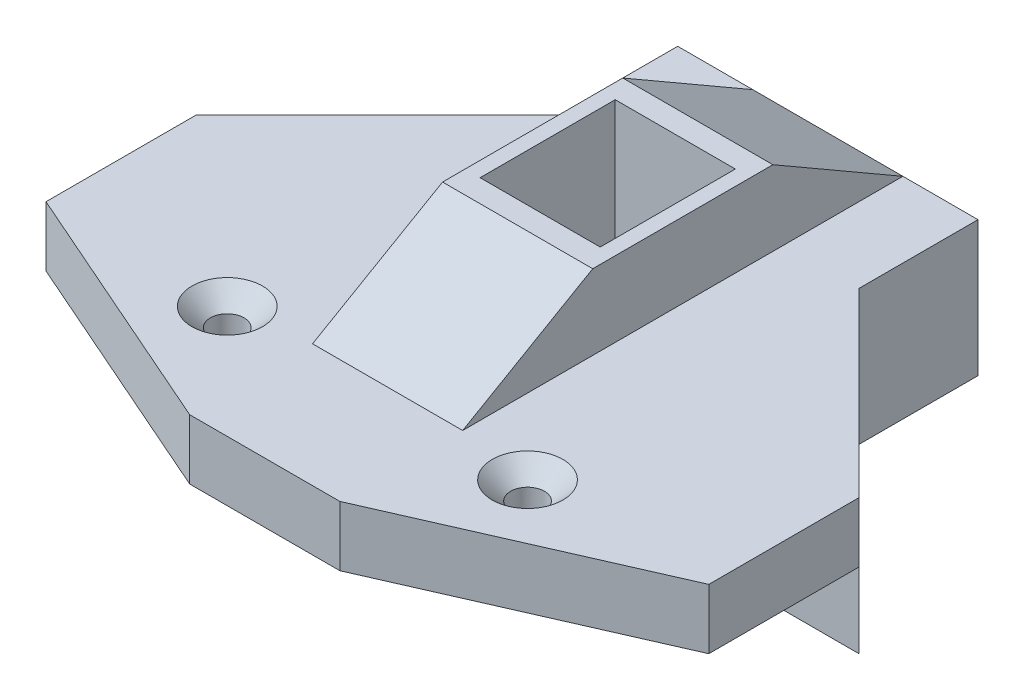
ISO-10303-21;
HEADER;
FILE_DESCRIPTION(('STEP AP214'),'2;1');
FILE_NAME('part.step','',(''),(''),'','','');
FILE_SCHEMA(('AUTOMOTIVE_DESIGN { 1 0 10303 214 1 1 1 1 }'));
ENDSEC;
DATA;
#1=APPLICATION_CONTEXT('core data for automotive mechanical design processes');
#2=APPLICATION_PROTOCOL_DEFINITION('international standard','automotive_design',2000,#1);
#3=PRODUCT_CONTEXT('',#1,'mechanical');
#4=PRODUCT('Part','Part','',(#3));
#5=PRODUCT_RELATED_PRODUCT_CATEGORY('part','',(#4));
#6=PRODUCT_DEFINITION_FORMATION('','',#4);
#7=PRODUCT_DEFINITION_CONTEXT('part definition',#1,'design');
#8=PRODUCT_DEFINITION('design','',#6,#7);
#9=PRODUCT_DEFINITION_SHAPE('','',#8);
#10=(LENGTH_UNIT() NAMED_UNIT(*) SI_UNIT(.MILLI.,.METRE.));
#11=(NAMED_UNIT(*) PLANE_ANGLE_UNIT() SI_UNIT($,.RADIAN.));
#12=(NAMED_UNIT(*) SI_UNIT($,.STERADIAN.) SOLID_ANGLE_UNIT());
#13=UNCERTAINTY_MEASURE_WITH_UNIT(LENGTH_MEASURE(1.E-05),#10,'distance_accuracy_value','');
#14=(GEOMETRIC_REPRESENTATION_CONTEXT(3) GLOBAL_UNCERTAINTY_ASSIGNED_CONTEXT((#13)) GLOBAL_UNIT_ASSIGNED_CONTEXT((#10,
#11,#12)) REPRESENTATION_CONTEXT('',''));
#15=CARTESIAN_POINT('',(0.,0.,0.));
#16=DIRECTION('',(0.,0.,1.));
#17=DIRECTION('',(1.,0.,0.));
#18=AXIS2_PLACEMENT_3D('',#15,#16,#17);
#19=CARTESIAN_POINT('',(0.,10.,0.));
#20=DIRECTION('',(0.,-1.,0.));
#21=DIRECTION('',(0.,0.,-1.));
#22=AXIS2_PLACEMENT_3D('',#19,#20,#21);
#23=PLANE('',#22);
#24=DIRECTION('',(0.,0.,1.));
#25=VECTOR('',#24,1.);
#26=CARTESIAN_POINT('',(8.00000000000001,10.,0.));
#27=LINE('',#26,#25);
#28=CARTESIAN_POINT('',(8.,10.,-39.679491924311));
#29=VERTEX_POINT('',#28);
#30=CARTESIAN_POINT('',(8.,10.,-21.679491924311));
#31=VERTEX_POINT('',#30);
#32=EDGE_CURVE('E256',#29,#31,#27,.T.);
#33=ORIENTED_EDGE('',*,*,#32,.F.);
#34=DIRECTION('',(1.,0.,0.));
#35=VECTOR('',#34,1.);
#36=CARTESIAN_POINT('',(0.,10.,-39.679491924311));
#37=LINE('',#36,#35);
#38=CARTESIAN_POINT('',(-8.,10.,-39.679491924311));
#39=VERTEX_POINT('',#38);
#40=EDGE_CURVE('E244',#39,#29,#37,.T.);
#41=ORIENTED_EDGE('',*,*,#40,.F.);
#42=DIRECTION('',(0.,0.,-1.));
#43=VECTOR('',#42,1.);
#44=CARTESIAN_POINT('',(-8.,10.,0.));
#45=LINE('',#44,#43);
#46=CARTESIAN_POINT('',(-8.,10.,-21.679491924311));
#47=VERTEX_POINT('',#46);
#48=EDGE_CURVE('E219',#47,#39,#45,.T.);
#49=ORIENTED_EDGE('',*,*,#48,.F.);
#50=DIRECTION('',(-1.,0.,0.));
#51=VECTOR('',#50,1.);
#52=CARTESIAN_POINT('',(0.,10.,-21.679491924311));
#53=LINE('',#52,#51);
#54=EDGE_CURVE('E253',#31,#47,#53,.T.);
#55=ORIENTED_EDGE('',*,*,#54,.F.);
#56=EDGE_LOOP('',(#33,#41,#49,#55));
#57=FACE_BOUND('',#56,.T.);
#58=CARTESIAN_POINT('',(-20.,10.,0.));
#59=DIRECTION('',(0.,-1.,0.));
#60=DIRECTION('',(0.,0.,-1.));
#61=AXIS2_PLACEMENT_3D('',#58,#59,#60);
#62=CIRCLE('',#61,2.24999999999999);
#63=CARTESIAN_POINT('',(-20.,10.,-2.24999999999999));
#64=VERTEX_POINT('',#63);
#65=EDGE_CURVE('E47',#64,#64,#62,.T.);
#66=ORIENTED_EDGE('',*,*,#65,.F.);
#67=EDGE_LOOP('',(#66));
#68=FACE_BOUND('',#67,.T.);
#69=CARTESIAN_POINT('',(20.,10.,0.));
#70=DIRECTION('',(0.,-1.,0.));
#71=DIRECTION('',(0.,0.,-1.));
#72=AXIS2_PLACEMENT_3D('',#69,#70,#71);
#73=CIRCLE('',#72,2.24999999999999);
#74=CARTESIAN_POINT('',(20.,10.,-2.24999999999999));
#75=VERTEX_POINT('',#74);
#76=EDGE_CURVE('E315',#75,#75,#73,.T.);
#77=ORIENTED_EDGE('',*,*,#76,.F.);
#78=EDGE_LOOP('',(#77));
#79=FACE_BOUND('',#78,.T.);
#80=DIRECTION('',(-1.,0.,0.));
#81=VECTOR('',#80,1.);
#82=CARTESIAN_POINT('',(-10.,10.,-60.));
#83=LINE('',#82,#81);
#84=CARTESIAN_POINT('',(10.,10.,-60.));
#85=VERTEX_POINT('',#84);
#86=CARTESIAN_POINT('',(-10.,10.,-60.));
#87=VERTEX_POINT('',#86);
#88=EDGE_CURVE('E415',#85,#87,#83,.T.);
#89=ORIENTED_EDGE('',*,*,#88,.F.);
#90=DIRECTION('',(0.,0.,1.));
#91=VECTOR('',#90,1.);
#92=CARTESIAN_POINT('',(10.,10.,-40.0000000000001));
#93=LINE('',#92,#91);
#94=CARTESIAN_POINT('',(10.,10.,-40.0000000000001));
#95=VERTEX_POINT('',#94);
#96=EDGE_CURVE('E337',#85,#95,#93,.T.);
#97=ORIENTED_EDGE('',*,*,#96,.T.);
#98=DIRECTION('',(0.707106781186546,0.,0.707106781186549));
#99=VECTOR('',#98,1.);
#100=CARTESIAN_POINT('',(30.,10.,-20.));
#101=LINE('',#100,#99);
#102=CARTESIAN_POINT('',(30.,10.,-20.));
#103=VERTEX_POINT('',#102);
#104=EDGE_CURVE('E359',#95,#103,#101,.T.);
#105=ORIENTED_EDGE('',*,*,#104,.T.);
#106=DIRECTION('',(1.,0.,0.));
#107=VECTOR('',#106,1.);
#108=CARTESIAN_POINT('',(30.,10.,-20.));
#109=LINE('',#108,#107);
#110=CARTESIAN_POINT('',(44.1421356237308,10.,-19.9999999999996));
#111=VERTEX_POINT('',#110);
#112=EDGE_CURVE('E332',#103,#111,#109,.T.);
#113=ORIENTED_EDGE('',*,*,#112,.T.);
#114=DIRECTION('',(0.,0.,-1.));
#115=VECTOR('',#114,1.);
#116=CARTESIAN_POINT('',(44.1421356237309,10.,-4.47558656802016E-13));
#117=LINE('',#116,#115);
#118=CARTESIAN_POINT('',(44.1421356237309,10.,-4.47558656802016E-13));
#119=VERTEX_POINT('',#118);
#120=EDGE_CURVE('E411',#119,#111,#117,.T.);
#121=ORIENTED_EDGE('',*,*,#120,.F.);
#122=DIRECTION('',(0.915537698439928,0.,-0.402232175161709));
#123=VECTOR('',#122,1.);
#124=CARTESIAN_POINT('',(44.1421356237309,10.,-4.47558656802016E-13));
#125=LINE('',#124,#123);
#126=CARTESIAN_POINT('',(10.,10.,15.));
#127=VERTEX_POINT('',#126);
#128=EDGE_CURVE('E408',#127,#119,#125,.T.);
#129=ORIENTED_EDGE('',*,*,#128,.F.);
#130=DIRECTION('',(1.,0.,0.));
#131=VECTOR('',#130,1.);
#132=CARTESIAN_POINT('',(-10.,10.,15.));
#133=LINE('',#132,#131);
#134=CARTESIAN_POINT('',(-10.,10.,15.));
#135=VERTEX_POINT('',#134);
#136=EDGE_CURVE('E405',#135,#127,#133,.T.);
#137=ORIENTED_EDGE('',*,*,#136,.F.);
#138=DIRECTION('',(0.915537698439932,0.,0.402232175161698));
#139=VECTOR('',#138,1.);
#140=CARTESIAN_POINT('',(-44.1421356237309,10.,0.));
#141=LINE('',#140,#139);
#142=CARTESIAN_POINT('',(-44.1421356237309,10.,0.));
#143=VERTEX_POINT('',#142);
#144=EDGE_CURVE('E355',#143,#135,#141,.T.);
#145=ORIENTED_EDGE('',*,*,#144,.F.);
#146=DIRECTION('',(0.,0.,1.));
#147=VECTOR('',#146,1.);
#148=CARTESIAN_POINT('',(-44.1421356237309,10.,-20.));
#149=LINE('',#148,#147);
#150=CARTESIAN_POINT('',(-44.1421356237309,10.,-20.));
#151=VERTEX_POINT('',#150);
#152=EDGE_CURVE('E371',#151,#143,#149,.T.);
#153=ORIENTED_EDGE('',*,*,#152,.F.);
#154=DIRECTION('',(1.,0.,0.));
#155=VECTOR('',#154,1.);
#156=CARTESIAN_POINT('',(-30.,10.,-20.));
#157=LINE('',#156,#155);
#158=CARTESIAN_POINT('',(-30.,10.,-20.));
#159=VERTEX_POINT('',#158);
#160=EDGE_CURVE('E450',#151,#159,#157,.T.);
#161=ORIENTED_EDGE('',*,*,#160,.T.);
#162=DIRECTION('',(0.707106781186545,0.,-0.70710678118655));
#163=VECTOR('',#162,1.);
#164=CARTESIAN_POINT('',(-30.,10.,-20.));
#165=LINE('',#164,#163);
#166=CARTESIAN_POINT('',(-10.,10.,-40.0000000000001));
#167=VERTEX_POINT('',#166);
#168=EDGE_CURVE('E454',#159,#167,#165,.T.);
#169=ORIENTED_EDGE('',*,*,#168,.T.);
#170=DIRECTION('',(0.,0.,-1.));
#171=VECTOR('',#170,1.);
#172=CARTESIAN_POINT('',(-10.,10.,-40.0000000000001));
#173=LINE('',#172,#171);
#174=EDGE_CURVE('E459',#167,#87,#173,.T.);
#175=ORIENTED_EDGE('',*,*,#174,.T.);
#176=EDGE_LOOP('',(#89,#97,#105,#113,#121,#129,#137,#145,#153,#161,#169,#175));
#177=FACE_BOUND('',#176,.T.);
#178=ADVANCED_FACE('F43',(#57,#68,#79,#177),#23,.T.);
#179=CARTESIAN_POINT('',(-10.,10.,-60.));
#180=DIRECTION('',(0.,0.,1.));
#181=DIRECTION('',(1.,0.,0.));
#182=AXIS2_PLACEMENT_3D('',#179,#180,#181);
#183=PLANE('',#182);
#184=DIRECTION('',(-1.,0.,0.));
#185=VECTOR('',#184,1.);
#186=CARTESIAN_POINT('',(-10.,0.,-60.));
#187=LINE('',#186,#185);
#188=CARTESIAN_POINT('',(-10.,0.,-60.));
#189=VERTEX_POINT('',#188);
#190=CARTESIAN_POINT('',(-20.,0.,-60.));
#191=VERTEX_POINT('',#190);
#192=EDGE_CURVE('E449',#189,#191,#187,.T.);
#193=ORIENTED_EDGE('',*,*,#192,.T.);
#194=DIRECTION('',(0.,-1.,0.));
#195=VECTOR('',#194,1.);
#196=CARTESIAN_POINT('',(-20.,10.,-60.));
#197=LINE('',#196,#195);
#198=CARTESIAN_POINT('',(-20.,18.,-60.));
#199=VERTEX_POINT('',#198);
#200=EDGE_CURVE('E11',#199,#191,#197,.T.);
#201=ORIENTED_EDGE('',*,*,#200,.F.);
#202=DIRECTION('',(-1.,0.,0.));
#203=VECTOR('',#202,1.);
#204=CARTESIAN_POINT('',(20.,18.,-60.));
#205=LINE('',#204,#203);
#206=CARTESIAN_POINT('',(-10.,18.,-60.));
#207=VERTEX_POINT('',#206);
#208=EDGE_CURVE('E386',#207,#199,#205,.T.);
#209=ORIENTED_EDGE('',*,*,#208,.F.);
#210=DIRECTION('',(-1.,0.,0.));
#211=VECTOR('',#210,1.);
#212=CARTESIAN_POINT('',(10.,18.,-60.));
#213=LINE('',#212,#211);
#214=CARTESIAN_POINT('',(10.,18.,-60.));
#215=VERTEX_POINT('',#214);
#216=EDGE_CURVE('E296',#215,#207,#213,.T.);
#217=ORIENTED_EDGE('',*,*,#216,.F.);
#218=CARTESIAN_POINT('',(20.,18.,-60.));
#219=VERTEX_POINT('',#218);
#220=EDGE_CURVE('E387',#219,#215,#205,.T.);
#221=ORIENTED_EDGE('',*,*,#220,.F.);
#222=DIRECTION('',(0.,-1.,0.));
#223=VECTOR('',#222,1.);
#224=CARTESIAN_POINT('',(20.,18.,-60.));
#225=LINE('',#224,#223);
#226=CARTESIAN_POINT('',(20.,0.,-60.));
#227=VERTEX_POINT('',#226);
#228=EDGE_CURVE('E427',#219,#227,#225,.T.);
#229=ORIENTED_EDGE('',*,*,#228,.T.);
#230=DIRECTION('',(-1.,0.,0.));
#231=VECTOR('',#230,1.);
#232=CARTESIAN_POINT('',(10.,0.,-60.));
#233=LINE('',#232,#231);
#234=CARTESIAN_POINT('',(10.,0.,-60.));
#235=VERTEX_POINT('',#234);
#236=EDGE_CURVE('E333',#227,#235,#233,.T.);
#237=ORIENTED_EDGE('',*,*,#236,.T.);
#238=DIRECTION('',(0.,-1.,0.));
#239=VECTOR('',#238,1.);
#240=CARTESIAN_POINT('',(10.,10.,-60.));
#241=LINE('',#240,#239);
#242=EDGE_CURVE('E328',#85,#235,#241,.T.);
#243=ORIENTED_EDGE('',*,*,#242,.F.);
#244=ORIENTED_EDGE('',*,*,#88,.T.);
#245=DIRECTION('',(0.,-1.,0.));
#246=VECTOR('',#245,1.);
#247=CARTESIAN_POINT('',(-10.,10.,-60.));
#248=LINE('',#247,#246);
#249=EDGE_CURVE('E463',#87,#189,#248,.T.);
#250=ORIENTED_EDGE('',*,*,#249,.T.);
#251=EDGE_LOOP('',(#193,#201,#209,#217,#221,#229,#237,#243,#244,#250));
#252=FACE_BOUND('',#251,.T.);
#253=ADVANCED_FACE('F45',(#252),#183,.F.);
#254=CARTESIAN_POINT('',(-20.,10.,-60.));
#255=DIRECTION('',(1.,0.,0.));
#256=DIRECTION('',(0.,0.,-1.));
#257=AXIS2_PLACEMENT_3D('',#254,#255,#256);
#258=PLANE('',#257);
#259=DIRECTION('',(0.,0.,1.));
#260=VECTOR('',#259,1.);
#261=CARTESIAN_POINT('',(-20.,0.,-60.));
#262=LINE('',#261,#260);
#263=CARTESIAN_POINT('',(-20.,0.,-44.1421356237311));
#264=VERTEX_POINT('',#263);
#265=EDGE_CURVE('E467',#191,#264,#262,.T.);
#266=ORIENTED_EDGE('',*,*,#265,.T.);
#267=DIRECTION('',(0.,-1.,0.));
#268=VECTOR('',#267,1.);
#269=CARTESIAN_POINT('',(-20.,10.,-44.1421356237311));
#270=LINE('',#269,#268);
#271=CARTESIAN_POINT('',(-20.,18.,-44.1421356237311));
#272=VERTEX_POINT('',#271);
#273=EDGE_CURVE('E53',#272,#264,#270,.T.);
#274=ORIENTED_EDGE('',*,*,#273,.F.);
#275=DIRECTION('',(0.,0.,1.));
#276=VECTOR('',#275,1.);
#277=CARTESIAN_POINT('',(-20.,18.,-60.));
#278=LINE('',#277,#276);
#279=EDGE_CURVE('E391',#199,#272,#278,.T.);
#280=ORIENTED_EDGE('',*,*,#279,.F.);
#281=ORIENTED_EDGE('',*,*,#200,.T.);
#282=EDGE_LOOP('',(#266,#274,#280,#281));
#283=FACE_BOUND('',#282,.T.);
#284=ADVANCED_FACE('F528',(#283),#258,.F.);
#285=CARTESIAN_POINT('',(-20.,10.,-44.1421356237311));
#286=DIRECTION('',(0.707106781186549,0.,0.707106781186546));
#287=DIRECTION('',(0.707106781186546,0.,-0.707106781186549));
#288=AXIS2_PLACEMENT_3D('',#285,#286,#287);
#289=PLANE('',#288);
#290=DIRECTION('',(-0.707106781186546,0.,0.707106781186549));
#291=VECTOR('',#290,1.);
#292=CARTESIAN_POINT('',(-20.,0.,-44.1421356237311));
#293=LINE('',#292,#291);
#294=CARTESIAN_POINT('',(-44.1421356237309,0.,-20.));
#295=VERTEX_POINT('',#294);
#296=EDGE_CURVE('E470',#264,#295,#293,.T.);
#297=ORIENTED_EDGE('',*,*,#296,.T.);
#298=DIRECTION('',(0.,-1.,0.));
#299=VECTOR('',#298,1.);
#300=CARTESIAN_POINT('',(-44.1421356237309,10.,-20.));
#301=LINE('',#300,#299);
#302=EDGE_CURVE('E492',#151,#295,#301,.T.);
#303=ORIENTED_EDGE('',*,*,#302,.F.);
#304=DIRECTION('',(0.,-1.,0.));
#305=VECTOR('',#304,1.);
#306=CARTESIAN_POINT('',(-44.1421356237309,18.,-20.));
#307=LINE('',#306,#305);
#308=CARTESIAN_POINT('',(-44.1421356237309,18.,-20.));
#309=VERTEX_POINT('',#308);
#310=EDGE_CURVE('E423',#309,#151,#307,.T.);
#311=ORIENTED_EDGE('',*,*,#310,.F.);
#312=DIRECTION('',(-0.707106781186546,0.,0.707106781186549));
#313=VECTOR('',#312,1.);
#314=CARTESIAN_POINT('',(-20.,18.,-44.1421356237311));
#315=LINE('',#314,#313);
#316=EDGE_CURVE('E395',#272,#309,#315,.T.);
#317=ORIENTED_EDGE('',*,*,#316,.F.);
#318=ORIENTED_EDGE('',*,*,#273,.T.);
#319=EDGE_LOOP('',(#297,#303,#311,#317,#318));
#320=FACE_BOUND('',#319,.T.);
#321=ADVANCED_FACE('F535',(#320),#289,.F.);
#322=CARTESIAN_POINT('',(-30.,10.,-20.));
#323=DIRECTION('',(0.,0.,-1.));
#324=DIRECTION('',(-1.,0.,0.));
#325=AXIS2_PLACEMENT_3D('',#322,#323,#324);
#326=PLANE('',#325);
#327=DIRECTION('',(1.,0.,0.));
#328=VECTOR('',#327,1.);
#329=CARTESIAN_POINT('',(-30.,0.,-20.));
#330=LINE('',#329,#328);
#331=CARTESIAN_POINT('',(-30.,0.,-20.));
#332=VERTEX_POINT('',#331);
#333=EDGE_CURVE('E473',#295,#332,#330,.T.);
#334=ORIENTED_EDGE('',*,*,#333,.T.);
#335=DIRECTION('',(0.,-1.,0.));
#336=VECTOR('',#335,1.);
#337=CARTESIAN_POINT('',(-30.,10.,-20.));
#338=LINE('',#337,#336);
#339=EDGE_CURVE('E488',#159,#332,#338,.T.);
#340=ORIENTED_EDGE('',*,*,#339,.F.);
#341=ORIENTED_EDGE('',*,*,#160,.F.);
#342=ORIENTED_EDGE('',*,*,#302,.T.);
#343=EDGE_LOOP('',(#334,#340,#341,#342));
#344=FACE_BOUND('',#343,.T.);
#345=ADVANCED_FACE('F659',(#344),#326,.F.);
#346=CARTESIAN_POINT('',(-30.,10.,-20.));
#347=DIRECTION('',(-0.70710678118655,0.,-0.707106781186545));
#348=DIRECTION('',(-0.707106781186545,0.,0.70710678118655));
#349=AXIS2_PLACEMENT_3D('',#346,#347,#348);
#350=PLANE('',#349);
#351=DIRECTION('',(0.707106781186545,0.,-0.70710678118655));
#352=VECTOR('',#351,1.);
#353=CARTESIAN_POINT('',(-30.,0.,-20.));
#354=LINE('',#353,#352);
#355=CARTESIAN_POINT('',(-10.,0.,-40.0000000000001));
#356=VERTEX_POINT('',#355);
#357=EDGE_CURVE('E476',#332,#356,#354,.T.);
#358=ORIENTED_EDGE('',*,*,#357,.T.);
#359=DIRECTION('',(0.,-1.,0.));
#360=VECTOR('',#359,1.);
#361=CARTESIAN_POINT('',(-10.,10.,-40.0000000000001));
#362=LINE('',#361,#360);
#363=EDGE_CURVE('E484',#167,#356,#362,.T.);
#364=ORIENTED_EDGE('',*,*,#363,.F.);
#365=ORIENTED_EDGE('',*,*,#168,.F.);
#366=ORIENTED_EDGE('',*,*,#339,.T.);
#367=EDGE_LOOP('',(#358,#364,#365,#366));
#368=FACE_BOUND('',#367,.T.);
#369=ADVANCED_FACE('F656',(#368),#350,.F.);
#370=CARTESIAN_POINT('',(-10.,10.,-40.0000000000001));
#371=DIRECTION('',(-1.,0.,0.));
#372=DIRECTION('',(0.,0.,1.));
#373=AXIS2_PLACEMENT_3D('',#370,#371,#372);
#374=PLANE('',#373);
#375=DIRECTION('',(0.,0.,-1.));
#376=VECTOR('',#375,1.);
#377=CARTESIAN_POINT('',(-10.,0.,-40.0000000000001));
#378=LINE('',#377,#376);
#379=EDGE_CURVE('E455',#356,#189,#378,.T.);
#380=ORIENTED_EDGE('',*,*,#379,.T.);
#381=ORIENTED_EDGE('',*,*,#249,.F.);
#382=ORIENTED_EDGE('',*,*,#174,.F.);
#383=ORIENTED_EDGE('',*,*,#363,.T.);
#384=EDGE_LOOP('',(#380,#381,#382,#383));
#385=FACE_BOUND('',#384,.T.);
#386=ADVANCED_FACE('F516',(#385),#374,.F.);
#387=CARTESIAN_POINT('',(0.,0.,0.));
#388=DIRECTION('',(0.,1.,0.));
#389=DIRECTION('',(0.,0.,1.));
#390=AXIS2_PLACEMENT_3D('',#387,#388,#389);
#391=PLANE('',#390);
#392=ORIENTED_EDGE('',*,*,#192,.F.);
#393=ORIENTED_EDGE('',*,*,#379,.F.);
#394=ORIENTED_EDGE('',*,*,#357,.F.);
#395=ORIENTED_EDGE('',*,*,#333,.F.);
#396=ORIENTED_EDGE('',*,*,#296,.F.);
#397=ORIENTED_EDGE('',*,*,#265,.F.);
#398=EDGE_LOOP('',(#392,#393,#394,#395,#396,#397));
#399=FACE_BOUND('',#398,.T.);
#400=ADVANCED_FACE('F520',(#399),#391,.F.);
#401=CARTESIAN_POINT('',(-44.1421356237309,18.,0.));
#402=DIRECTION('',(0.402232175161698,0.,-0.915537698439932));
#403=DIRECTION('',(-0.915537698439933,0.,-0.402232175161699));
#404=AXIS2_PLACEMENT_3D('',#401,#402,#403);
#405=PLANE('',#404);
#406=ORIENTED_EDGE('',*,*,#144,.T.);
#407=DIRECTION('',(0.,-1.,0.));
#408=VECTOR('',#407,1.);
#409=CARTESIAN_POINT('',(-10.,18.,15.));
#410=LINE('',#409,#408);
#411=CARTESIAN_POINT('',(-10.,18.,15.));
#412=VERTEX_POINT('',#411);
#413=EDGE_CURVE('E445',#412,#135,#410,.T.);
#414=ORIENTED_EDGE('',*,*,#413,.F.);
#415=DIRECTION('',(0.915537698439932,0.,0.402232175161698));
#416=VECTOR('',#415,1.);
#417=CARTESIAN_POINT('',(-44.1421356237309,18.,0.));
#418=LINE('',#417,#416);
#419=CARTESIAN_POINT('',(-44.1421356237309,18.,0.));
#420=VERTEX_POINT('',#419);
#421=EDGE_CURVE('E366',#420,#412,#418,.T.);
#422=ORIENTED_EDGE('',*,*,#421,.F.);
#423=DIRECTION('',(0.,-1.,0.));
#424=VECTOR('',#423,1.);
#425=CARTESIAN_POINT('',(-44.1421356237309,18.,0.));
#426=LINE('',#425,#424);
#427=EDGE_CURVE('E401',#420,#143,#426,.T.);
#428=ORIENTED_EDGE('',*,*,#427,.T.);
#429=EDGE_LOOP('',(#406,#414,#422,#428));
#430=FACE_BOUND('',#429,.T.);
#431=ADVANCED_FACE('F546',(#430),#405,.F.);
#432=CARTESIAN_POINT('',(-10.,18.,15.));
#433=DIRECTION('',(0.,0.,-1.));
#434=DIRECTION('',(-1.,0.,0.));
#435=AXIS2_PLACEMENT_3D('',#432,#433,#434);
#436=PLANE('',#435);
#437=ORIENTED_EDGE('',*,*,#136,.T.);
#438=DIRECTION('',(0.,-1.,0.));
#439=VECTOR('',#438,1.);
#440=CARTESIAN_POINT('',(10.,18.,15.));
#441=LINE('',#440,#439);
#442=CARTESIAN_POINT('',(10.,18.,15.));
#443=VERTEX_POINT('',#442);
#444=EDGE_CURVE('E441',#443,#127,#441,.T.);
#445=ORIENTED_EDGE('',*,*,#444,.F.);
#446=DIRECTION('',(1.,0.,0.));
#447=VECTOR('',#446,1.);
#448=CARTESIAN_POINT('',(-10.,18.,15.));
#449=LINE('',#448,#447);
#450=EDGE_CURVE('E370',#412,#443,#449,.T.);
#451=ORIENTED_EDGE('',*,*,#450,.F.);
#452=ORIENTED_EDGE('',*,*,#413,.T.);
#453=EDGE_LOOP('',(#437,#445,#451,#452));
#454=FACE_BOUND('',#453,.T.);
#455=ADVANCED_FACE('F549',(#454),#436,.F.);
#456=CARTESIAN_POINT('',(44.1421356237309,18.,-4.47558656802016E-13));
#457=DIRECTION('',(-0.402232175161708,0.,-0.915537698439928));
#458=DIRECTION('',(-0.915537698439928,0.,0.402232175161709));
#459=AXIS2_PLACEMENT_3D('',#456,#457,#458);
#460=PLANE('',#459);
#461=ORIENTED_EDGE('',*,*,#128,.T.);
#462=DIRECTION('',(0.,-1.,0.));
#463=VECTOR('',#462,1.);
#464=CARTESIAN_POINT('',(44.1421356237309,18.,-4.47558656802016E-13));
#465=LINE('',#464,#463);
#466=CARTESIAN_POINT('',(44.1421356237309,18.,-4.47558656802016E-13));
#467=VERTEX_POINT('',#466);
#468=EDGE_CURVE('E437',#467,#119,#465,.T.);
#469=ORIENTED_EDGE('',*,*,#468,.F.);
#470=DIRECTION('',(0.915537698439928,0.,-0.402232175161709));
#471=VECTOR('',#470,1.);
#472=CARTESIAN_POINT('',(44.1421356237309,18.,-4.47558656802016E-13));
#473=LINE('',#472,#471);
#474=EDGE_CURVE('E374',#443,#467,#473,.T.);
#475=ORIENTED_EDGE('',*,*,#474,.F.);
#476=ORIENTED_EDGE('',*,*,#444,.T.);
#477=EDGE_LOOP('',(#461,#469,#475,#476));
#478=FACE_BOUND('',#477,.T.);
#479=ADVANCED_FACE('F554',(#478),#460,.F.);
#480=CARTESIAN_POINT('',(44.1421356237309,18.,-4.47558656802016E-13));
#481=DIRECTION('',(-1.,0.,0.));
#482=DIRECTION('',(0.,0.,1.));
#483=AXIS2_PLACEMENT_3D('',#480,#481,#482);
#484=PLANE('',#483);
#485=ORIENTED_EDGE('',*,*,#120,.T.);
#486=DIRECTION('',(0.,-1.,0.));
#487=VECTOR('',#486,1.);
#488=CARTESIAN_POINT('',(44.1421356237308,18.,-19.9999999999996));
#489=LINE('',#488,#487);
#490=CARTESIAN_POINT('',(44.1421356237308,18.,-19.9999999999996));
#491=VERTEX_POINT('',#490);
#492=EDGE_CURVE('E433',#491,#111,#489,.T.);
#493=ORIENTED_EDGE('',*,*,#492,.F.);
#494=DIRECTION('',(0.,0.,-1.));
#495=VECTOR('',#494,1.);
#496=CARTESIAN_POINT('',(44.1421356237309,18.,-4.47558656802016E-13));
#497=LINE('',#496,#495);
#498=EDGE_CURVE('E377',#467,#491,#497,.T.);
#499=ORIENTED_EDGE('',*,*,#498,.F.);
#500=ORIENTED_EDGE('',*,*,#468,.T.);
#501=EDGE_LOOP('',(#485,#493,#499,#500));
#502=FACE_BOUND('',#501,.T.);
#503=ADVANCED_FACE('F560',(#502),#484,.F.);
#504=CARTESIAN_POINT('',(44.1421356237308,18.,-19.9999999999996));
#505=DIRECTION('',(-0.707106781186557,0.,0.707106781186538));
#506=DIRECTION('',(0.707106781186538,0.,0.707106781186557));
#507=AXIS2_PLACEMENT_3D('',#504,#505,#506);
#508=PLANE('',#507);
#509=ORIENTED_EDGE('',*,*,#492,.T.);
#510=DIRECTION('',(0.,-1.,0.));
#511=VECTOR('',#510,1.);
#512=CARTESIAN_POINT('',(44.1421356237308,10.,-19.9999999999996));
#513=LINE('',#512,#511);
#514=CARTESIAN_POINT('',(44.1421356237308,0.,-19.9999999999996));
#515=VERTEX_POINT('',#514);
#516=EDGE_CURVE('E324',#111,#515,#513,.T.);
#517=ORIENTED_EDGE('',*,*,#516,.T.);
#518=DIRECTION('',(-0.707106781186538,0.,-0.707106781186557));
#519=VECTOR('',#518,1.);
#520=CARTESIAN_POINT('',(20.,0.,-44.142135623731));
#521=LINE('',#520,#519);
#522=CARTESIAN_POINT('',(20.,0.,-44.142135623731));
#523=VERTEX_POINT('',#522);
#524=EDGE_CURVE('E341',#515,#523,#521,.T.);
#525=ORIENTED_EDGE('',*,*,#524,.T.);
#526=DIRECTION('',(0.,-1.,0.));
#527=VECTOR('',#526,1.);
#528=CARTESIAN_POINT('',(20.,18.,-44.142135623731));
#529=LINE('',#528,#527);
#530=CARTESIAN_POINT('',(20.,18.,-44.142135623731));
#531=VERTEX_POINT('',#530);
#532=EDGE_CURVE('E430',#531,#523,#529,.T.);
#533=ORIENTED_EDGE('',*,*,#532,.F.);
#534=DIRECTION('',(-0.707106781186538,0.,-0.707106781186557));
#535=VECTOR('',#534,1.);
#536=CARTESIAN_POINT('',(44.1421356237308,18.,-19.9999999999996));
#537=LINE('',#536,#535);
#538=EDGE_CURVE('E380',#491,#531,#537,.T.);
#539=ORIENTED_EDGE('',*,*,#538,.F.);
#540=EDGE_LOOP('',(#509,#517,#525,#533,#539));
#541=FACE_BOUND('',#540,.T.);
#542=ADVANCED_FACE('F563',(#541),#508,.F.);
#543=CARTESIAN_POINT('',(20.,18.,-44.142135623731));
#544=DIRECTION('',(-1.,0.,0.));
#545=DIRECTION('',(0.,0.,1.));
#546=AXIS2_PLACEMENT_3D('',#543,#544,#545);
#547=PLANE('',#546);
#548=ORIENTED_EDGE('',*,*,#532,.T.);
#549=DIRECTION('',(0.,0.,-1.));
#550=VECTOR('',#549,1.);
#551=CARTESIAN_POINT('',(20.,0.,-60.));
#552=LINE('',#551,#550);
#553=EDGE_CURVE('E336',#523,#227,#552,.T.);
#554=ORIENTED_EDGE('',*,*,#553,.T.);
#555=ORIENTED_EDGE('',*,*,#228,.F.);
#556=DIRECTION('',(0.,0.,-1.));
#557=VECTOR('',#556,1.);
#558=CARTESIAN_POINT('',(20.,18.,-44.142135623731));
#559=LINE('',#558,#557);
#560=EDGE_CURVE('E383',#531,#219,#559,.T.);
#561=ORIENTED_EDGE('',*,*,#560,.F.);
#562=EDGE_LOOP('',(#548,#554,#555,#561));
#563=FACE_BOUND('',#562,.T.);
#564=ADVANCED_FACE('F569',(#563),#547,.F.);
#565=CARTESIAN_POINT('',(-44.1421356237309,18.,-20.));
#566=DIRECTION('',(1.,0.,0.));
#567=DIRECTION('',(0.,0.,-1.));
#568=AXIS2_PLACEMENT_3D('',#565,#566,#567);
#569=PLANE('',#568);
#570=ORIENTED_EDGE('',*,*,#152,.T.);
#571=ORIENTED_EDGE('',*,*,#427,.F.);
#572=DIRECTION('',(0.,0.,1.));
#573=VECTOR('',#572,1.);
#574=CARTESIAN_POINT('',(-44.1421356237309,18.,-20.));
#575=LINE('',#574,#573);
#576=EDGE_CURVE('E398',#309,#420,#575,.T.);
#577=ORIENTED_EDGE('',*,*,#576,.F.);
#578=ORIENTED_EDGE('',*,*,#310,.T.);
#579=EDGE_LOOP('',(#570,#571,#577,#578));
#580=FACE_BOUND('',#579,.T.);
#581=ADVANCED_FACE('F541',(#580),#569,.F.);
#582=CARTESIAN_POINT('',(0.,18.,0.));
#583=DIRECTION('',(0.,-1.,0.));
#584=DIRECTION('',(0.,0.,-1.));
#585=AXIS2_PLACEMENT_3D('',#582,#583,#584);
#586=PLANE('',#585);
#587=DIRECTION('',(-1.,0.,0.));
#588=VECTOR('',#587,1.);
#589=CARTESIAN_POINT('',(10.,18.,-1.35898384862197));
#590=LINE('',#589,#588);
#591=CARTESIAN_POINT('',(10.,18.,-1.35898384862197));
#592=VERTEX_POINT('',#591);
#593=CARTESIAN_POINT('',(-10.,18.,-1.35898384862197));
#594=VERTEX_POINT('',#593);
#595=EDGE_CURVE('E273',#592,#594,#590,.T.);
#596=ORIENTED_EDGE('',*,*,#595,.T.);
#597=DIRECTION('',(0.,0.,-1.));
#598=VECTOR('',#597,1.);
#599=CARTESIAN_POINT('',(-10.,18.,-44.142135623731));
#600=LINE('',#599,#598);
#601=EDGE_CURVE('E259',#594,#207,#600,.T.);
#602=ORIENTED_EDGE('',*,*,#601,.T.);
#603=ORIENTED_EDGE('',*,*,#208,.T.);
#604=ORIENTED_EDGE('',*,*,#279,.T.);
#605=ORIENTED_EDGE('',*,*,#316,.T.);
#606=ORIENTED_EDGE('',*,*,#576,.T.);
#607=ORIENTED_EDGE('',*,*,#421,.T.);
#608=ORIENTED_EDGE('',*,*,#450,.T.);
#609=ORIENTED_EDGE('',*,*,#474,.T.);
#610=ORIENTED_EDGE('',*,*,#498,.T.);
#611=ORIENTED_EDGE('',*,*,#538,.T.);
#612=ORIENTED_EDGE('',*,*,#560,.T.);
#613=ORIENTED_EDGE('',*,*,#220,.T.);
#614=DIRECTION('',(0.,0.,-1.));
#615=VECTOR('',#614,1.);
#616=CARTESIAN_POINT('',(10.,18.,-1.35898384862197));
#617=LINE('',#616,#615);
#618=EDGE_CURVE('E260',#592,#215,#617,.T.);
#619=ORIENTED_EDGE('',*,*,#618,.F.);
#620=EDGE_LOOP('',(#596,#602,#603,#604,#605,#606,#607,#608,#609,#610,#611,#612,#613,#619));
#621=FACE_BOUND('',#620,.T.);
#622=CARTESIAN_POINT('',(-20.,18.,0.));
#623=DIRECTION('',(0.,1.,0.));
#624=DIRECTION('',(0.,0.,1.));
#625=AXIS2_PLACEMENT_3D('',#622,#623,#624);
#626=CIRCLE('',#625,4.7);
#627=CARTESIAN_POINT('',(-20.,18.,4.7));
#628=VERTEX_POINT('',#627);
#629=EDGE_CURVE('E299',#628,#628,#626,.T.);
#630=ORIENTED_EDGE('',*,*,#629,.F.);
#631=EDGE_LOOP('',(#630));
#632=FACE_BOUND('',#631,.T.);
#633=CARTESIAN_POINT('',(20.,18.,0.));
#634=DIRECTION('',(0.,1.,0.));
#635=DIRECTION('',(0.,0.,1.));
#636=AXIS2_PLACEMENT_3D('',#633,#634,#635);
#637=CIRCLE('',#636,4.7);
#638=CARTESIAN_POINT('',(20.,18.,4.7));
#639=VERTEX_POINT('',#638);
#640=EDGE_CURVE('E307',#639,#639,#637,.T.);
#641=ORIENTED_EDGE('',*,*,#640,.F.);
#642=EDGE_LOOP('',(#641));
#643=FACE_BOUND('',#642,.T.);
#644=ADVANCED_FACE('F531',(#621,#632,#643),#586,.F.);
#645=CARTESIAN_POINT('',(10.,10.,-40.0000000000001));
#646=DIRECTION('',(1.,0.,0.));
#647=DIRECTION('',(0.,0.,-1.));
#648=AXIS2_PLACEMENT_3D('',#645,#646,#647);
#649=PLANE('',#648);
#650=DIRECTION('',(0.,0.,1.));
#651=VECTOR('',#650,1.);
#652=CARTESIAN_POINT('',(10.,0.,-40.0000000000001));
#653=LINE('',#652,#651);
#654=CARTESIAN_POINT('',(10.,0.,-40.0000000000001));
#655=VERTEX_POINT('',#654);
#656=EDGE_CURVE('E351',#235,#655,#653,.T.);
#657=ORIENTED_EDGE('',*,*,#656,.T.);
#658=DIRECTION('',(0.,-1.,0.));
#659=VECTOR('',#658,1.);
#660=CARTESIAN_POINT('',(10.,10.,-40.0000000000001));
#661=LINE('',#660,#659);
#662=EDGE_CURVE('E316',#95,#655,#661,.T.);
#663=ORIENTED_EDGE('',*,*,#662,.F.);
#664=ORIENTED_EDGE('',*,*,#96,.F.);
#665=ORIENTED_EDGE('',*,*,#242,.T.);
#666=EDGE_LOOP('',(#657,#663,#664,#665));
#667=FACE_BOUND('',#666,.T.);
#668=ADVANCED_FACE('F621',(#667),#649,.F.);
#669=CARTESIAN_POINT('',(30.,10.,-20.));
#670=DIRECTION('',(0.707106781186549,0.,-0.707106781186546));
#671=DIRECTION('',(-0.707106781186546,0.,-0.707106781186549));
#672=AXIS2_PLACEMENT_3D('',#669,#670,#671);
#673=PLANE('',#672);
#674=DIRECTION('',(0.707106781186546,0.,0.707106781186549));
#675=VECTOR('',#674,1.);
#676=CARTESIAN_POINT('',(30.,0.,-20.));
#677=LINE('',#676,#675);
#678=CARTESIAN_POINT('',(30.,0.,-20.));
#679=VERTEX_POINT('',#678);
#680=EDGE_CURVE('E348',#655,#679,#677,.T.);
#681=ORIENTED_EDGE('',*,*,#680,.T.);
#682=DIRECTION('',(0.,-1.,0.));
#683=VECTOR('',#682,1.);
#684=CARTESIAN_POINT('',(30.,10.,-20.));
#685=LINE('',#684,#683);
#686=EDGE_CURVE('E320',#103,#679,#685,.T.);
#687=ORIENTED_EDGE('',*,*,#686,.F.);
#688=ORIENTED_EDGE('',*,*,#104,.F.);
#689=ORIENTED_EDGE('',*,*,#662,.T.);
#690=EDGE_LOOP('',(#681,#687,#688,#689));
#691=FACE_BOUND('',#690,.T.);
#692=ADVANCED_FACE('F624',(#691),#673,.F.);
#693=CARTESIAN_POINT('',(30.,10.,-20.));
#694=DIRECTION('',(0.,0.,-1.));
#695=DIRECTION('',(-1.,0.,0.));
#696=AXIS2_PLACEMENT_3D('',#693,#694,#695);
#697=PLANE('',#696);
#698=DIRECTION('',(1.,0.,0.));
#699=VECTOR('',#698,1.);
#700=CARTESIAN_POINT('',(30.,0.,-20.));
#701=LINE('',#700,#699);
#702=EDGE_CURVE('E345',#679,#515,#701,.T.);
#703=ORIENTED_EDGE('',*,*,#702,.T.);
#704=ORIENTED_EDGE('',*,*,#516,.F.);
#705=ORIENTED_EDGE('',*,*,#112,.F.);
#706=ORIENTED_EDGE('',*,*,#686,.T.);
#707=EDGE_LOOP('',(#703,#704,#705,#706));
#708=FACE_BOUND('',#707,.T.);
#709=ADVANCED_FACE('F628',(#708),#697,.F.);
#710=CARTESIAN_POINT('',(0.,0.,0.));
#711=DIRECTION('',(0.,-1.,0.));
#712=DIRECTION('',(0.,0.,-1.));
#713=AXIS2_PLACEMENT_3D('',#710,#711,#712);
#714=PLANE('',#713);
#715=ORIENTED_EDGE('',*,*,#656,.F.);
#716=ORIENTED_EDGE('',*,*,#236,.F.);
#717=ORIENTED_EDGE('',*,*,#553,.F.);
#718=ORIENTED_EDGE('',*,*,#524,.F.);
#719=ORIENTED_EDGE('',*,*,#702,.F.);
#720=ORIENTED_EDGE('',*,*,#680,.F.);
#721=EDGE_LOOP('',(#715,#716,#717,#718,#719,#720));
#722=FACE_BOUND('',#721,.T.);
#723=ADVANCED_FACE('F620',(#722),#714,.T.);
#724=CARTESIAN_POINT('',(20.,18.,0.));
#725=DIRECTION('',(0.,1.,0.));
#726=DIRECTION('',(0.,0.,1.));
#727=AXIS2_PLACEMENT_3D('',#724,#725,#726);
#728=CYLINDRICAL_SURFACE('',#727,2.24999999999999);
#729=ORIENTED_EDGE('',*,*,#76,.T.);
#730=EDGE_LOOP('',(#729));
#731=FACE_BOUND('',#730,.T.);
#732=CARTESIAN_POINT('',(20.,15.55,0.));
#733=DIRECTION('',(0.,1.,0.));
#734=DIRECTION('',(0.,0.,1.));
#735=AXIS2_PLACEMENT_3D('',#732,#733,#734);
#736=CIRCLE('',#735,2.24999999999999);
#737=CARTESIAN_POINT('',(20.,15.55,2.24999999999999));
#738=VERTEX_POINT('',#737);
#739=EDGE_CURVE('E311',#738,#738,#736,.T.);
#740=ORIENTED_EDGE('',*,*,#739,.T.);
#741=EDGE_LOOP('',(#740));
#742=FACE_BOUND('',#741,.T.);
#743=ADVANCED_FACE('F502',(#731,#742),#728,.F.);
#744=CARTESIAN_POINT('',(20.,18.,0.));
#745=DIRECTION('',(0.,1.,0.));
#746=DIRECTION('',(0.,0.,1.));
#747=AXIS2_PLACEMENT_3D('',#744,#745,#746);
#748=CONICAL_SURFACE('',#747,4.7,0.785398163397448);
#749=ORIENTED_EDGE('',*,*,#739,.F.);
#750=EDGE_LOOP('',(#749));
#751=FACE_BOUND('',#750,.T.);
#752=ORIENTED_EDGE('',*,*,#640,.T.);
#753=EDGE_LOOP('',(#752));
#754=FACE_BOUND('',#753,.T.);
#755=ADVANCED_FACE('F613',(#751,#754),#748,.F.);
#756=CARTESIAN_POINT('',(-20.,18.,0.));
#757=DIRECTION('',(0.,1.,0.));
#758=DIRECTION('',(0.,0.,1.));
#759=AXIS2_PLACEMENT_3D('',#756,#757,#758);
#760=CYLINDRICAL_SURFACE('',#759,2.24999999999999);
#761=ORIENTED_EDGE('',*,*,#65,.T.);
#762=EDGE_LOOP('',(#761));
#763=FACE_BOUND('',#762,.T.);
#764=CARTESIAN_POINT('',(-20.,15.55,0.));
#765=DIRECTION('',(0.,1.,0.));
#766=DIRECTION('',(0.,0.,1.));
#767=AXIS2_PLACEMENT_3D('',#764,#765,#766);
#768=CIRCLE('',#767,2.24999999999999);
#769=CARTESIAN_POINT('',(-20.,15.55,2.24999999999999));
#770=VERTEX_POINT('',#769);
#771=EDGE_CURVE('E303',#770,#770,#768,.T.);
#772=ORIENTED_EDGE('',*,*,#771,.T.);
#773=EDGE_LOOP('',(#772));
#774=FACE_BOUND('',#773,.T.);
#775=ADVANCED_FACE('F609',(#763,#774),#760,.F.);
#776=CARTESIAN_POINT('',(-20.,18.,0.));
#777=DIRECTION('',(0.,1.,0.));
#778=DIRECTION('',(0.,0.,1.));
#779=AXIS2_PLACEMENT_3D('',#776,#777,#778);
#780=CONICAL_SURFACE('',#779,4.7,0.785398163397448);
#781=ORIENTED_EDGE('',*,*,#771,.F.);
#782=EDGE_LOOP('',(#781));
#783=FACE_BOUND('',#782,.T.);
#784=ORIENTED_EDGE('',*,*,#629,.T.);
#785=EDGE_LOOP('',(#784));
#786=FACE_BOUND('',#785,.T.);
#787=ADVANCED_FACE('F606',(#783,#786),#780,.F.);
#788=CARTESIAN_POINT('',(10.,18.,-60.));
#789=DIRECTION('',(0.,-0.866025403784442,0.499999999999995));
#790=DIRECTION('',(0.,-0.499999999999995,-0.866025403784442));
#791=AXIS2_PLACEMENT_3D('',#788,#789,#790);
#792=PLANE('',#791);
#793=DIRECTION('',(0.,0.499999999999995,0.866025403784442));
#794=VECTOR('',#793,1.);
#795=CARTESIAN_POINT('',(-10.,18.,-60.));
#796=LINE('',#795,#794);
#797=CARTESIAN_POINT('',(-10.,28.,-42.679491924311));
#798=VERTEX_POINT('',#797);
#799=EDGE_CURVE('E277',#207,#798,#796,.T.);
#800=ORIENTED_EDGE('',*,*,#799,.T.);
#801=DIRECTION('',(-1.,0.,0.));
#802=VECTOR('',#801,1.);
#803=CARTESIAN_POINT('',(10.,28.,-42.679491924311));
#804=LINE('',#803,#802);
#805=CARTESIAN_POINT('',(10.,28.,-42.679491924311));
#806=VERTEX_POINT('',#805);
#807=EDGE_CURVE('E292',#806,#798,#804,.T.);
#808=ORIENTED_EDGE('',*,*,#807,.F.);
#809=DIRECTION('',(0.,0.499999999999995,0.866025403784442));
#810=VECTOR('',#809,1.);
#811=CARTESIAN_POINT('',(10.,18.,-60.));
#812=LINE('',#811,#810);
#813=EDGE_CURVE('E263',#215,#806,#812,.T.);
#814=ORIENTED_EDGE('',*,*,#813,.F.);
#815=ORIENTED_EDGE('',*,*,#216,.T.);
#816=EDGE_LOOP('',(#800,#808,#814,#815));
#817=FACE_BOUND('',#816,.T.);
#818=ADVANCED_FACE('F575',(#817),#792,.F.);
#819=CARTESIAN_POINT('',(10.,28.,-42.679491924311));
#820=DIRECTION('',(0.,-1.,0.));
#821=DIRECTION('',(0.,0.,-1.));
#822=AXIS2_PLACEMENT_3D('',#819,#820,#821);
#823=PLANE('',#822);
#824=DIRECTION('',(-1.,0.,0.));
#825=VECTOR('',#824,1.);
#826=CARTESIAN_POINT('',(-8.,28.,-39.679491924311));
#827=LINE('',#826,#825);
#828=CARTESIAN_POINT('',(8.,28.,-39.679491924311));
#829=VERTEX_POINT('',#828);
#830=CARTESIAN_POINT('',(-8.,28.,-39.679491924311));
#831=VERTEX_POINT('',#830);
#832=EDGE_CURVE('E226',#829,#831,#827,.T.);
#833=ORIENTED_EDGE('',*,*,#832,.F.);
#834=DIRECTION('',(0.,0.,-1.));
#835=VECTOR('',#834,1.);
#836=CARTESIAN_POINT('',(8.,28.,-39.679491924311));
#837=LINE('',#836,#835);
#838=CARTESIAN_POINT('',(8.,28.,-21.679491924311));
#839=VERTEX_POINT('',#838);
#840=EDGE_CURVE('E69',#839,#829,#837,.T.);
#841=ORIENTED_EDGE('',*,*,#840,.F.);
#842=DIRECTION('',(1.,0.,0.));
#843=VECTOR('',#842,1.);
#844=CARTESIAN_POINT('',(-8.,28.,-21.679491924311));
#845=LINE('',#844,#843);
#846=CARTESIAN_POINT('',(-8.,28.,-21.679491924311));
#847=VERTEX_POINT('',#846);
#848=EDGE_CURVE('E234',#847,#839,#845,.T.);
#849=ORIENTED_EDGE('',*,*,#848,.F.);
#850=DIRECTION('',(0.,0.,1.));
#851=VECTOR('',#850,1.);
#852=CARTESIAN_POINT('',(-8.,28.,-39.679491924311));
#853=LINE('',#852,#851);
#854=EDGE_CURVE('E216',#831,#847,#853,.T.);
#855=ORIENTED_EDGE('',*,*,#854,.F.);
#856=EDGE_LOOP('',(#833,#841,#849,#855));
#857=FACE_BOUND('',#856,.T.);
#858=DIRECTION('',(0.,0.,1.));
#859=VECTOR('',#858,1.);
#860=CARTESIAN_POINT('',(-10.,28.,-42.679491924311));
#861=LINE('',#860,#859);
#862=CARTESIAN_POINT('',(-10.,28.,-18.679491924311));
#863=VERTEX_POINT('',#862);
#864=EDGE_CURVE('E280',#798,#863,#861,.T.);
#865=ORIENTED_EDGE('',*,*,#864,.T.);
#866=DIRECTION('',(-1.,0.,0.));
#867=VECTOR('',#866,1.);
#868=CARTESIAN_POINT('',(10.,28.,-18.679491924311));
#869=LINE('',#868,#867);
#870=CARTESIAN_POINT('',(10.,28.,-18.679491924311));
#871=VERTEX_POINT('',#870);
#872=EDGE_CURVE('E288',#871,#863,#869,.T.);
#873=ORIENTED_EDGE('',*,*,#872,.F.);
#874=DIRECTION('',(0.,0.,1.));
#875=VECTOR('',#874,1.);
#876=CARTESIAN_POINT('',(10.,28.,-42.679491924311));
#877=LINE('',#876,#875);
#878=EDGE_CURVE('E267',#806,#871,#877,.T.);
#879=ORIENTED_EDGE('',*,*,#878,.F.);
#880=ORIENTED_EDGE('',*,*,#807,.T.);
#881=EDGE_LOOP('',(#865,#873,#879,#880));
#882=FACE_BOUND('',#881,.T.);
#883=ADVANCED_FACE('F231',(#857,#882),#823,.F.);
#884=CARTESIAN_POINT('',(10.,28.,-18.679491924311));
#885=DIRECTION('',(0.,-0.866025403784442,-0.499999999999995));
#886=DIRECTION('',(0.,0.499999999999995,-0.866025403784442));
#887=AXIS2_PLACEMENT_3D('',#884,#885,#886);
#888=PLANE('',#887);
#889=DIRECTION('',(0.,-0.499999999999995,0.866025403784442));
#890=VECTOR('',#889,1.);
#891=CARTESIAN_POINT('',(-10.,28.,-18.679491924311));
#892=LINE('',#891,#890);
#893=EDGE_CURVE('E264',#863,#594,#892,.T.);
#894=ORIENTED_EDGE('',*,*,#893,.T.);
#895=ORIENTED_EDGE('',*,*,#595,.F.);
#896=DIRECTION('',(0.,-0.499999999999995,0.866025403784442));
#897=VECTOR('',#896,1.);
#898=CARTESIAN_POINT('',(10.,28.,-18.679491924311));
#899=LINE('',#898,#897);
#900=EDGE_CURVE('E270',#871,#592,#899,.T.);
#901=ORIENTED_EDGE('',*,*,#900,.F.);
#902=ORIENTED_EDGE('',*,*,#872,.T.);
#903=EDGE_LOOP('',(#894,#895,#901,#902));
#904=FACE_BOUND('',#903,.T.);
#905=ADVANCED_FACE('F585',(#904),#888,.F.);
#906=CARTESIAN_POINT('',(10.,0.,0.));
#907=DIRECTION('',(1.,0.,0.));
#908=DIRECTION('',(0.,0.,-1.));
#909=AXIS2_PLACEMENT_3D('',#906,#907,#908);
#910=PLANE('',#909);
#911=ORIENTED_EDGE('',*,*,#618,.T.);
#912=ORIENTED_EDGE('',*,*,#813,.T.);
#913=ORIENTED_EDGE('',*,*,#878,.T.);
#914=ORIENTED_EDGE('',*,*,#900,.T.);
#915=EDGE_LOOP('',(#911,#912,#913,#914));
#916=FACE_BOUND('',#915,.T.);
#917=ADVANCED_FACE('F589',(#916),#910,.T.);
#918=CARTESIAN_POINT('',(-10.,0.,0.));
#919=DIRECTION('',(1.,0.,0.));
#920=DIRECTION('',(0.,0.,-1.));
#921=AXIS2_PLACEMENT_3D('',#918,#919,#920);
#922=PLANE('',#921);
#923=ORIENTED_EDGE('',*,*,#601,.F.);
#924=ORIENTED_EDGE('',*,*,#893,.F.);
#925=ORIENTED_EDGE('',*,*,#864,.F.);
#926=ORIENTED_EDGE('',*,*,#799,.F.);
#927=EDGE_LOOP('',(#923,#924,#925,#926));
#928=FACE_BOUND('',#927,.T.);
#929=ADVANCED_FACE('F580',(#928),#922,.F.);
#930=CARTESIAN_POINT('',(8.,8.,-39.679491924311));
#931=DIRECTION('',(1.,0.,0.));
#932=DIRECTION('',(0.,0.,-1.));
#933=AXIS2_PLACEMENT_3D('',#930,#931,#932);
#934=PLANE('',#933);
#935=ORIENTED_EDGE('',*,*,#32,.T.);
#936=DIRECTION('',(0.,1.,0.));
#937=VECTOR('',#936,1.);
#938=CARTESIAN_POINT('',(8.,7.99999999999999,-21.679491924311));
#939=LINE('',#938,#937);
#940=EDGE_CURVE('E241',#31,#839,#939,.T.);
#941=ORIENTED_EDGE('',*,*,#940,.T.);
#942=ORIENTED_EDGE('',*,*,#840,.T.);
#943=DIRECTION('',(0.,1.,0.));
#944=VECTOR('',#943,1.);
#945=CARTESIAN_POINT('',(8.,8.,-39.679491924311));
#946=LINE('',#945,#944);
#947=EDGE_CURVE('E223',#29,#829,#946,.T.);
#948=ORIENTED_EDGE('',*,*,#947,.F.);
#949=EDGE_LOOP('',(#935,#941,#942,#948));
#950=FACE_BOUND('',#949,.T.);
#951=ADVANCED_FACE('F596',(#950),#934,.F.);
#952=CARTESIAN_POINT('',(-8.,7.99999999999999,-21.679491924311));
#953=DIRECTION('',(0.,0.,1.));
#954=DIRECTION('',(0.,-1.,0.));
#955=AXIS2_PLACEMENT_3D('',#952,#953,#954);
#956=PLANE('',#955);
#957=ORIENTED_EDGE('',*,*,#54,.T.);
#958=DIRECTION('',(0.,1.,0.));
#959=VECTOR('',#958,1.);
#960=CARTESIAN_POINT('',(-8.,7.99999999999999,-21.679491924311));
#961=LINE('',#960,#959);
#962=EDGE_CURVE('E222',#47,#847,#961,.T.);
#963=ORIENTED_EDGE('',*,*,#962,.T.);
#964=ORIENTED_EDGE('',*,*,#848,.T.);
#965=ORIENTED_EDGE('',*,*,#940,.F.);
#966=EDGE_LOOP('',(#957,#963,#964,#965));
#967=FACE_BOUND('',#966,.T.);
#968=ADVANCED_FACE('F701',(#967),#956,.F.);
#969=CARTESIAN_POINT('',(-8.,8.,-39.679491924311));
#970=DIRECTION('',(-1.,0.,0.));
#971=DIRECTION('',(0.,0.,1.));
#972=AXIS2_PLACEMENT_3D('',#969,#970,#971);
#973=PLANE('',#972);
#974=ORIENTED_EDGE('',*,*,#48,.T.);
#975=DIRECTION('',(0.,1.,0.));
#976=VECTOR('',#975,1.);
#977=CARTESIAN_POINT('',(-8.,8.,-39.679491924311));
#978=LINE('',#977,#976);
#979=EDGE_CURVE('E61',#39,#831,#978,.T.);
#980=ORIENTED_EDGE('',*,*,#979,.T.);
#981=ORIENTED_EDGE('',*,*,#854,.T.);
#982=ORIENTED_EDGE('',*,*,#962,.F.);
#983=EDGE_LOOP('',(#974,#980,#981,#982));
#984=FACE_BOUND('',#983,.T.);
#985=ADVANCED_FACE('F213',(#984),#973,.F.);
#986=CARTESIAN_POINT('',(-8.,8.,-39.679491924311));
#987=DIRECTION('',(0.,0.,-1.));
#988=DIRECTION('',(0.,1.,0.));
#989=AXIS2_PLACEMENT_3D('',#986,#987,#988);
#990=PLANE('',#989);
#991=ORIENTED_EDGE('',*,*,#40,.T.);
#992=ORIENTED_EDGE('',*,*,#947,.T.);
#993=ORIENTED_EDGE('',*,*,#832,.T.);
#994=ORIENTED_EDGE('',*,*,#979,.F.);
#995=EDGE_LOOP('',(#991,#992,#993,#994));
#996=FACE_BOUND('',#995,.T.);
#997=ADVANCED_FACE('F227',(#996),#990,.F.);
#998=CLOSED_SHELL('',(#178,#253,#284,#321,#345,#369,#386,#400,#431,#455,#479,#503,#542,#564,
#581,#644,#668,#692,#709,#723,#743,#755,#775,#787,#818,#883,#905,#917,#929,#951,#968,#985,#997));
#999=MANIFOLD_SOLID_BREP('B2',#998);
#1000=ADVANCED_BREP_SHAPE_REPRESENTATION('',(#18,#999),#14);
#1001=SHAPE_DEFINITION_REPRESENTATION(#9,#1000);
ENDSEC;
END-ISO-10303-21;
